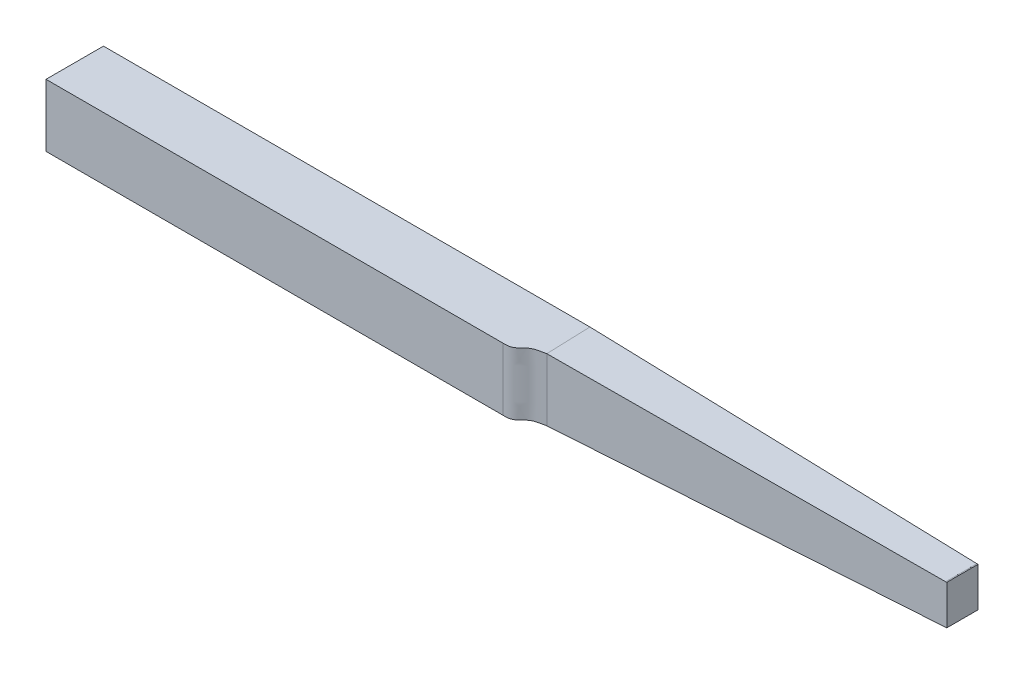
ISO-10303-21;
HEADER;
FILE_DESCRIPTION(('STEP AP214'),'2;1');
FILE_NAME('part.step','',(''),(''),'','','');
FILE_SCHEMA(('AUTOMOTIVE_DESIGN { 1 0 10303 214 1 1 1 1 }'));
ENDSEC;
DATA;
#1=APPLICATION_CONTEXT('core data for automotive mechanical design processes');
#2=APPLICATION_PROTOCOL_DEFINITION('international standard','automotive_design',2000,#1);
#3=PRODUCT_CONTEXT('',#1,'mechanical');
#4=PRODUCT('Part','Part','',(#3));
#5=PRODUCT_RELATED_PRODUCT_CATEGORY('part','',(#4));
#6=PRODUCT_DEFINITION_FORMATION('','',#4);
#7=PRODUCT_DEFINITION_CONTEXT('part definition',#1,'design');
#8=PRODUCT_DEFINITION('design','',#6,#7);
#9=PRODUCT_DEFINITION_SHAPE('','',#8);
#10=(LENGTH_UNIT() NAMED_UNIT(*) SI_UNIT(.MILLI.,.METRE.));
#11=(NAMED_UNIT(*) PLANE_ANGLE_UNIT() SI_UNIT($,.RADIAN.));
#12=(NAMED_UNIT(*) SI_UNIT($,.STERADIAN.) SOLID_ANGLE_UNIT());
#13=UNCERTAINTY_MEASURE_WITH_UNIT(LENGTH_MEASURE(1.E-05),#10,'distance_accuracy_value','');
#14=(GEOMETRIC_REPRESENTATION_CONTEXT(3) GLOBAL_UNCERTAINTY_ASSIGNED_CONTEXT((#13)) GLOBAL_UNIT_ASSIGNED_CONTEXT((#10,
#11,#12)) REPRESENTATION_CONTEXT('',''));
#15=CARTESIAN_POINT('',(0.,0.,0.));
#16=DIRECTION('',(0.,0.,1.));
#17=DIRECTION('',(1.,0.,0.));
#18=AXIS2_PLACEMENT_3D('',#15,#16,#17);
#19=CARTESIAN_POINT('',(0.,0.,0.));
#20=DIRECTION('',(0.,1.,0.));
#21=DIRECTION('',(0.,0.,1.));
#22=AXIS2_PLACEMENT_3D('',#19,#20,#21);
#23=PLANE('',#22);
#24=DIRECTION('',(-1.,0.,0.));
#25=VECTOR('',#24,1.);
#26=CARTESIAN_POINT('',(560.,0.,-36.8));
#27=LINE('',#26,#25);
#28=CARTESIAN_POINT('',(63.0124444444445,0.,-36.8));
#29=VERTEX_POINT('',#28);
#30=CARTESIAN_POINT('',(-560.,0.,-36.8));
#31=VERTEX_POINT('',#30);
#32=EDGE_CURVE('E84',#29,#31,#27,.T.);
#33=ORIENTED_EDGE('',*,*,#32,.F.);
#34=DIRECTION('',(0.0347265168990722,0.,0.999396852618647));
#35=VECTOR('',#34,1.);
#36=CARTESIAN_POINT('',(62.2218786480743,0.,-59.5517482094918));
#37=LINE('',#36,#35);
#38=CARTESIAN_POINT('',(65.,0.,20.4));
#39=VERTEX_POINT('',#38);
#40=EDGE_CURVE('E357',#29,#39,#37,.T.);
#41=ORIENTED_EDGE('',*,*,#40,.T.);
#42=CARTESIAN_POINT('',(65.,0.,20.4));
#43=CARTESIAN_POINT('',(56.7842442634511,0.,22.1075772442084));
#44=CARTESIAN_POINT('',(47.8187669649591,0.,23.3374381089836));
#45=CARTESIAN_POINT('',(39.8430139715066,0.,33.586115732493));
#46=CARTESIAN_POINT('',(32.9877524311891,0.,36.6310590317051));
#47=CARTESIAN_POINT('',(31.1757146223452,0.,36.8));
#48=CARTESIAN_POINT('',(25.,0.,36.8));
#49=B_SPLINE_CURVE_WITH_KNOTS('',3,(#42,#43,#44,#45,#46,#47,#48),.UNSPECIFIED.,.F.,.F.,(4,1,1,1,
4),(0.,0.422650190738557,0.727847648192994,0.789397597337319,1.),.UNSPECIFIED.);
#50=CARTESIAN_POINT('',(25.,0.,36.8));
#51=VERTEX_POINT('',#50);
#52=EDGE_CURVE('E145',#39,#51,#49,.T.);
#53=ORIENTED_EDGE('',*,*,#52,.T.);
#54=DIRECTION('',(1.,0.,0.));
#55=VECTOR('',#54,1.);
#56=CARTESIAN_POINT('',(560.,0.,36.8));
#57=LINE('',#56,#55);
#58=CARTESIAN_POINT('',(-560.,0.,36.8));
#59=VERTEX_POINT('',#58);
#60=EDGE_CURVE('E99',#59,#51,#57,.T.);
#61=ORIENTED_EDGE('',*,*,#60,.F.);
#62=DIRECTION('',(0.,0.,1.));
#63=VECTOR('',#62,1.);
#64=CARTESIAN_POINT('',(-560.,0.,36.8));
#65=LINE('',#64,#63);
#66=EDGE_CURVE('E104',#31,#59,#65,.T.);
#67=ORIENTED_EDGE('',*,*,#66,.F.);
#68=EDGE_LOOP('',(#33,#41,#53,#61,#67));
#69=FACE_BOUND('',#68,.T.);
#70=ADVANCED_FACE('F45',(#69),#23,.F.);
#71=CARTESIAN_POINT('',(560.,80.,36.8));
#72=DIRECTION('',(0.,0.,-1.));
#73=DIRECTION('',(-1.,0.,0.));
#74=AXIS2_PLACEMENT_3D('',#71,#72,#73);
#75=PLANE('',#74);
#76=ORIENTED_EDGE('',*,*,#60,.T.);
#77=DIRECTION('',(0.,1.,0.));
#78=VECTOR('',#77,1.);
#79=CARTESIAN_POINT('',(25.,0.,36.8));
#80=LINE('',#79,#78);
#81=CARTESIAN_POINT('',(25.,80.,36.8));
#82=VERTEX_POINT('',#81);
#83=EDGE_CURVE('E133',#51,#82,#80,.T.);
#84=ORIENTED_EDGE('',*,*,#83,.T.);
#85=DIRECTION('',(1.,0.,0.));
#86=VECTOR('',#85,1.);
#87=CARTESIAN_POINT('',(560.,80.,36.8));
#88=LINE('',#87,#86);
#89=CARTESIAN_POINT('',(-560.,80.,36.8));
#90=VERTEX_POINT('',#89);
#91=EDGE_CURVE('E130',#90,#82,#88,.T.);
#92=ORIENTED_EDGE('',*,*,#91,.F.);
#93=DIRECTION('',(0.,-1.,0.));
#94=VECTOR('',#93,1.);
#95=CARTESIAN_POINT('',(-560.,80.,36.8));
#96=LINE('',#95,#94);
#97=EDGE_CURVE('E54',#90,#59,#96,.T.);
#98=ORIENTED_EDGE('',*,*,#97,.T.);
#99=EDGE_LOOP('',(#76,#84,#92,#98));
#100=FACE_BOUND('',#99,.T.);
#101=ADVANCED_FACE('F127',(#100),#75,.F.);
#102=CARTESIAN_POINT('',(-560.,80.,36.8));
#103=DIRECTION('',(1.,0.,0.));
#104=DIRECTION('',(0.,0.,-1.));
#105=AXIS2_PLACEMENT_3D('',#102,#103,#104);
#106=PLANE('',#105);
#107=ORIENTED_EDGE('',*,*,#66,.T.);
#108=ORIENTED_EDGE('',*,*,#97,.F.);
#109=DIRECTION('',(0.,0.,1.));
#110=VECTOR('',#109,1.);
#111=CARTESIAN_POINT('',(-560.,80.,36.8));
#112=LINE('',#111,#110);
#113=CARTESIAN_POINT('',(-560.,80.,-36.8));
#114=VERTEX_POINT('',#113);
#115=EDGE_CURVE('E98',#114,#90,#112,.T.);
#116=ORIENTED_EDGE('',*,*,#115,.F.);
#117=DIRECTION('',(0.,-1.,0.));
#118=VECTOR('',#117,1.);
#119=CARTESIAN_POINT('',(-560.,80.,-36.8));
#120=LINE('',#119,#118);
#121=EDGE_CURVE('E88',#114,#31,#120,.T.);
#122=ORIENTED_EDGE('',*,*,#121,.T.);
#123=EDGE_LOOP('',(#107,#108,#116,#122));
#124=FACE_BOUND('',#123,.T.);
#125=ADVANCED_FACE('F47',(#124),#106,.F.);
#126=CARTESIAN_POINT('',(560.,80.,36.8));
#127=DIRECTION('',(-1.,0.,0.));
#128=DIRECTION('',(0.,0.,1.));
#129=AXIS2_PLACEMENT_3D('',#126,#127,#128);
#130=PLANE('',#129);
#131=DIRECTION('',(0.,-1.,0.));
#132=VECTOR('',#131,1.);
#133=CARTESIAN_POINT('',(560.,80.,-36.8));
#134=LINE('',#133,#132);
#135=CARTESIAN_POINT('',(560.,65.25,-36.8));
#136=VERTEX_POINT('',#135);
#137=CARTESIAN_POINT('',(560.,14.75,-36.8));
#138=VERTEX_POINT('',#137);
#139=EDGE_CURVE('E106',#136,#138,#134,.T.);
#140=ORIENTED_EDGE('',*,*,#139,.F.);
#141=DIRECTION('',(0.,0.,-1.));
#142=VECTOR('',#141,1.);
#143=CARTESIAN_POINT('',(560.,65.25,43.2));
#144=LINE('',#143,#142);
#145=CARTESIAN_POINT('',(560.,65.2500000000057,3.20000001103306));
#146=VERTEX_POINT('',#145);
#147=EDGE_CURVE('E316',#146,#136,#144,.T.);
#148=ORIENTED_EDGE('',*,*,#147,.F.);
#149=DIRECTION('',(0.,-1.,0.));
#150=VECTOR('',#149,1.);
#151=CARTESIAN_POINT('',(560.,1586.57882822116,3.2));
#152=LINE('',#151,#150);
#153=CARTESIAN_POINT('',(560.,14.75,3.20000000002681));
#154=VERTEX_POINT('',#153);
#155=EDGE_CURVE('E118',#146,#154,#152,.T.);
#156=ORIENTED_EDGE('',*,*,#155,.T.);
#157=DIRECTION('',(0.,0.,-1.));
#158=VECTOR('',#157,1.);
#159=CARTESIAN_POINT('',(560.,14.75,43.2));
#160=LINE('',#159,#158);
#161=EDGE_CURVE('E338',#154,#138,#160,.T.);
#162=ORIENTED_EDGE('',*,*,#161,.T.);
#163=EDGE_LOOP('',(#140,#148,#156,#162));
#164=FACE_BOUND('',#163,.T.);
#165=ADVANCED_FACE('F182',(#164),#130,.F.);
#166=CARTESIAN_POINT('',(560.,80.,-36.8));
#167=DIRECTION('',(0.,0.,1.));
#168=DIRECTION('',(1.,0.,0.));
#169=AXIS2_PLACEMENT_3D('',#166,#167,#168);
#170=PLANE('',#169);
#171=DIRECTION('',(0.999557404333975,-0.0297488729387744,0.));
#172=VECTOR('',#171,1.);
#173=CARTESIAN_POINT('',(559.560168279036,65.2217240547224,-36.8));
#174=LINE('',#173,#172);
#175=CARTESIAN_POINT('',(63.0124444444445,80.,-36.8));
#176=VERTEX_POINT('',#175);
#177=CARTESIAN_POINT('',(558.610101010101,65.25,-36.8));
#178=VERTEX_POINT('',#177);
#179=EDGE_CURVE('E330',#176,#178,#174,.T.);
#180=ORIENTED_EDGE('',*,*,#179,.T.);
#181=DIRECTION('',(-1.,0.,0.));
#182=VECTOR('',#181,1.);
#183=CARTESIAN_POINT('',(558.610101010101,65.25,-36.8));
#184=LINE('',#183,#182);
#185=EDGE_CURVE('E314',#136,#178,#184,.T.);
#186=ORIENTED_EDGE('',*,*,#185,.F.);
#187=ORIENTED_EDGE('',*,*,#139,.T.);
#188=DIRECTION('',(1.,0.,0.));
#189=VECTOR('',#188,1.);
#190=CARTESIAN_POINT('',(558.610101010101,14.75,-36.8));
#191=LINE('',#190,#189);
#192=CARTESIAN_POINT('',(558.610101010101,14.75,-36.8));
#193=VERTEX_POINT('',#192);
#194=EDGE_CURVE('E333',#193,#138,#191,.T.);
#195=ORIENTED_EDGE('',*,*,#194,.F.);
#196=DIRECTION('',(-0.999557404333975,-0.0297488729387745,0.));
#197=VECTOR('',#196,1.);
#198=CARTESIAN_POINT('',(561.93902477636,14.8490755805679,-36.8));
#199=LINE('',#198,#197);
#200=EDGE_CURVE('E93',#193,#29,#199,.T.);
#201=ORIENTED_EDGE('',*,*,#200,.T.);
#202=ORIENTED_EDGE('',*,*,#32,.T.);
#203=ORIENTED_EDGE('',*,*,#121,.F.);
#204=DIRECTION('',(-1.,0.,0.));
#205=VECTOR('',#204,1.);
#206=CARTESIAN_POINT('',(560.,80.,-36.8));
#207=LINE('',#206,#205);
#208=EDGE_CURVE('E70',#176,#114,#207,.T.);
#209=ORIENTED_EDGE('',*,*,#208,.F.);
#210=EDGE_LOOP('',(#180,#186,#187,#195,#201,#202,#203,#209));
#211=FACE_BOUND('',#210,.T.);
#212=ADVANCED_FACE('F87',(#211),#170,.F.);
#213=CARTESIAN_POINT('',(0.,80.,0.));
#214=DIRECTION('',(0.,1.,0.));
#215=DIRECTION('',(0.,0.,1.));
#216=AXIS2_PLACEMENT_3D('',#213,#214,#215);
#217=PLANE('',#216);
#218=DIRECTION('',(0.0347265168990722,0.,0.999396852618647));
#219=VECTOR('',#218,1.);
#220=CARTESIAN_POINT('',(62.2218786480743,80.,-59.5517482094918));
#221=LINE('',#220,#219);
#222=CARTESIAN_POINT('',(65.,80.,20.4));
#223=VERTEX_POINT('',#222);
#224=EDGE_CURVE('E326',#176,#223,#221,.T.);
#225=ORIENTED_EDGE('',*,*,#224,.F.);
#226=ORIENTED_EDGE('',*,*,#208,.T.);
#227=ORIENTED_EDGE('',*,*,#115,.T.);
#228=ORIENTED_EDGE('',*,*,#91,.T.);
#229=CARTESIAN_POINT('',(65.,80.,20.4));
#230=CARTESIAN_POINT('',(56.7842442634511,80.,22.1075772442084));
#231=CARTESIAN_POINT('',(47.8187669649591,80.,23.3374381089836));
#232=CARTESIAN_POINT('',(39.8430139715066,80.,33.586115732493));
#233=CARTESIAN_POINT('',(32.9877524311891,80.,36.6310590317051));
#234=CARTESIAN_POINT('',(31.1757146223452,80.,36.8));
#235=CARTESIAN_POINT('',(25.,80.,36.8));
#236=B_SPLINE_CURVE_WITH_KNOTS('',3,(#229,#230,#231,#232,#233,#234,#235),.UNSPECIFIED.,.F.,.F.,
(4,1,1,1,4),(0.,0.422650190738557,0.727847648192994,0.789397597337319,1.),.UNSPECIFIED.);
#237=EDGE_CURVE('E146',#223,#82,#236,.T.);
#238=ORIENTED_EDGE('',*,*,#237,.F.);
#239=EDGE_LOOP('',(#225,#226,#227,#228,#238));
#240=FACE_BOUND('',#239,.T.);
#241=ADVANCED_FACE('F136',(#240),#217,.T.);
#242=CARTESIAN_POINT('',(560.,1586.57882822116,3.2));
#243=DIRECTION('',(0.0347265168990722,0.,0.999396852618648));
#244=DIRECTION('',(0.999396852618648,0.,-0.0347265168990722));
#245=AXIS2_PLACEMENT_3D('',#242,#243,#244);
#246=PLANE('',#245);
#247=DIRECTION('',(0.,-1.,0.));
#248=VECTOR('',#247,1.);
#249=CARTESIAN_POINT('',(558.610101010112,1586.57882822116,3.24829548005267));
#250=LINE('',#249,#248);
#251=CARTESIAN_POINT('',(558.610101010101,65.2914161820223,3.24829548005307));
#252=VERTEX_POINT('',#251);
#253=CARTESIAN_POINT('',(558.610101010101,65.25,3.24829548005307));
#254=VERTEX_POINT('',#253);
#255=EDGE_CURVE('E295',#252,#254,#250,.T.);
#256=ORIENTED_EDGE('',*,*,#255,.F.);
#257=DIRECTION('',(0.998953990196033,-0.0297668108189726,-0.0347111285482258));
#258=VECTOR('',#257,1.);
#259=CARTESIAN_POINT('',(65.,80.,20.4));
#260=LINE('',#259,#258);
#261=EDGE_CURVE('E306',#223,#252,#260,.T.);
#262=ORIENTED_EDGE('',*,*,#261,.F.);
#263=DIRECTION('',(0.,-1.,0.));
#264=VECTOR('',#263,1.);
#265=CARTESIAN_POINT('',(65.,1586.57882822116,20.4));
#266=LINE('',#265,#264);
#267=EDGE_CURVE('E112',#223,#39,#266,.T.);
#268=ORIENTED_EDGE('',*,*,#267,.T.);
#269=DIRECTION('',(-0.998953990196033,-0.0297668108189727,0.0347111285482258));
#270=VECTOR('',#269,1.);
#271=CARTESIAN_POINT('',(65.,0.,20.4));
#272=LINE('',#271,#270);
#273=CARTESIAN_POINT('',(558.610101010101,14.7085838179778,3.24829548005307));
#274=VERTEX_POINT('',#273);
#275=EDGE_CURVE('E354',#274,#39,#272,.T.);
#276=ORIENTED_EDGE('',*,*,#275,.F.);
#277=DIRECTION('',(0.,-1.,0.));
#278=VECTOR('',#277,1.);
#279=CARTESIAN_POINT('',(558.610101010101,1586.57882822116,3.24829548005306));
#280=LINE('',#279,#278);
#281=CARTESIAN_POINT('',(558.610101010101,14.75,3.24829548005307));
#282=VERTEX_POINT('',#281);
#283=EDGE_CURVE('E61',#282,#274,#280,.T.);
#284=ORIENTED_EDGE('',*,*,#283,.F.);
#285=DIRECTION('',(-0.999396852618648,0.,0.0347265168990722));
#286=VECTOR('',#285,1.);
#287=CARTESIAN_POINT('',(560.,14.75,3.2));
#288=LINE('',#287,#286);
#289=EDGE_CURVE('E342',#154,#282,#288,.T.);
#290=ORIENTED_EDGE('',*,*,#289,.F.);
#291=ORIENTED_EDGE('',*,*,#155,.F.);
#292=DIRECTION('',(0.999396852618648,0.,-0.0347265168990722));
#293=VECTOR('',#292,1.);
#294=CARTESIAN_POINT('',(560.,65.25,3.2));
#295=LINE('',#294,#293);
#296=EDGE_CURVE('E307',#254,#146,#295,.T.);
#297=ORIENTED_EDGE('',*,*,#296,.F.);
#298=EDGE_LOOP('',(#256,#262,#268,#276,#284,#290,#291,#297));
#299=FACE_BOUND('',#298,.T.);
#300=ADVANCED_FACE('F170',(#299),#246,.T.);
#301=DIRECTION('',(0.,1.,0.));
#302=VECTOR('',#301,1.);
#303=SURFACE_OF_LINEAR_EXTRUSION('',#49,#302);
#304=ORIENTED_EDGE('',*,*,#237,.T.);
#305=ORIENTED_EDGE('',*,*,#83,.F.);
#306=ORIENTED_EDGE('',*,*,#52,.F.);
#307=ORIENTED_EDGE('',*,*,#267,.F.);
#308=EDGE_LOOP('',(#304,#305,#306,#307));
#309=FACE_BOUND('',#308,.T.);
#310=ADVANCED_FACE('F165',(#309),#303,.F.);
#311=CARTESIAN_POINT('',(62.2218786480743,0.,-59.5517482094918));
#312=DIRECTION('',(-0.029748857044976,0.99955687030487,0.00103369765893654));
#313=DIRECTION('',(-0.999557404333975,-0.0297488729387745,0.));
#314=AXIS2_PLACEMENT_3D('',#311,#312,#313);
#315=PLANE('',#314);
#316=ORIENTED_EDGE('',*,*,#200,.F.);
#317=DIRECTION('',(0.,-0.00103415537113261,0.999999465261191));
#318=VECTOR('',#317,1.);
#319=CARTESIAN_POINT('',(558.610101010101,14.7735130552411,-59.5364700934454));
#320=LINE('',#319,#318);
#321=EDGE_CURVE('E349',#193,#274,#320,.T.);
#322=ORIENTED_EDGE('',*,*,#321,.T.);
#323=ORIENTED_EDGE('',*,*,#275,.T.);
#324=ORIENTED_EDGE('',*,*,#40,.F.);
#325=EDGE_LOOP('',(#316,#322,#323,#324));
#326=FACE_BOUND('',#325,.T.);
#327=ADVANCED_FACE('F169',(#326),#315,.F.);
#328=CARTESIAN_POINT('',(558.610101010101,14.75,43.2));
#329=DIRECTION('',(0.,1.,0.));
#330=DIRECTION('',(0.,0.,1.));
#331=AXIS2_PLACEMENT_3D('',#328,#329,#330);
#332=PLANE('',#331);
#333=ORIENTED_EDGE('',*,*,#194,.T.);
#334=ORIENTED_EDGE('',*,*,#161,.F.);
#335=ORIENTED_EDGE('',*,*,#289,.T.);
#336=DIRECTION('',(0.,0.,-1.));
#337=VECTOR('',#336,1.);
#338=CARTESIAN_POINT('',(558.610101010101,14.75,43.2));
#339=LINE('',#338,#337);
#340=EDGE_CURVE('E337',#282,#193,#339,.T.);
#341=ORIENTED_EDGE('',*,*,#340,.T.);
#342=EDGE_LOOP('',(#333,#334,#335,#341));
#343=FACE_BOUND('',#342,.T.);
#344=ADVANCED_FACE('F242',(#343),#332,.F.);
#345=CARTESIAN_POINT('',(558.610101010101,0.,43.2));
#346=DIRECTION('',(-1.,0.,0.));
#347=DIRECTION('',(0.,0.,1.));
#348=AXIS2_PLACEMENT_3D('',#345,#346,#347);
#349=PLANE('',#348);
#350=ORIENTED_EDGE('',*,*,#283,.T.);
#351=ORIENTED_EDGE('',*,*,#321,.F.);
#352=ORIENTED_EDGE('',*,*,#340,.F.);
#353=EDGE_LOOP('',(#350,#351,#352));
#354=FACE_BOUND('',#353,.T.);
#355=ADVANCED_FACE('F251',(#354),#349,.F.);
#356=CARTESIAN_POINT('',(62.2218786480743,80.,-59.5517482094918));
#357=DIRECTION('',(-0.0297488570449759,-0.99955687030487,0.00103369765893654));
#358=DIRECTION('',(0.999557404333975,-0.0297488729387744,0.));
#359=AXIS2_PLACEMENT_3D('',#356,#357,#358);
#360=PLANE('',#359);
#361=ORIENTED_EDGE('',*,*,#261,.T.);
#362=DIRECTION('',(0.,-0.00103415537113261,-0.999999465261191));
#363=VECTOR('',#362,1.);
#364=CARTESIAN_POINT('',(558.610101010101,65.226486944759,-59.5364700934454));
#365=LINE('',#364,#363);
#366=EDGE_CURVE('E11',#252,#178,#365,.T.);
#367=ORIENTED_EDGE('',*,*,#366,.T.);
#368=ORIENTED_EDGE('',*,*,#179,.F.);
#369=ORIENTED_EDGE('',*,*,#224,.T.);
#370=EDGE_LOOP('',(#361,#367,#368,#369));
#371=FACE_BOUND('',#370,.T.);
#372=ADVANCED_FACE('F260',(#371),#360,.F.);
#373=CARTESIAN_POINT('',(558.610101010101,65.25,43.2));
#374=DIRECTION('',(0.,-1.,0.));
#375=DIRECTION('',(0.,0.,-1.));
#376=AXIS2_PLACEMENT_3D('',#373,#374,#375);
#377=PLANE('',#376);
#378=ORIENTED_EDGE('',*,*,#296,.T.);
#379=ORIENTED_EDGE('',*,*,#147,.T.);
#380=ORIENTED_EDGE('',*,*,#185,.T.);
#381=DIRECTION('',(0.,0.,-1.));
#382=VECTOR('',#381,1.);
#383=CARTESIAN_POINT('',(558.610101010101,65.25,43.2));
#384=LINE('',#383,#382);
#385=EDGE_CURVE('E298',#254,#178,#384,.T.);
#386=ORIENTED_EDGE('',*,*,#385,.F.);
#387=EDGE_LOOP('',(#378,#379,#380,#386));
#388=FACE_BOUND('',#387,.T.);
#389=ADVANCED_FACE('F267',(#388),#377,.F.);
#390=CARTESIAN_POINT('',(558.610101010101,80.,43.2));
#391=DIRECTION('',(-1.,0.,0.));
#392=DIRECTION('',(0.,-1.,0.));
#393=AXIS2_PLACEMENT_3D('',#390,#391,#392);
#394=PLANE('',#393);
#395=ORIENTED_EDGE('',*,*,#255,.T.);
#396=ORIENTED_EDGE('',*,*,#385,.T.);
#397=ORIENTED_EDGE('',*,*,#366,.F.);
#398=EDGE_LOOP('',(#395,#396,#397));
#399=FACE_BOUND('',#398,.T.);
#400=ADVANCED_FACE('F277',(#399),#394,.F.);
#401=CLOSED_SHELL('',(#70,#101,#125,#165,#212,#241,#300,#310,#327,#344,#355,#372,#389,#400));
#402=MANIFOLD_SOLID_BREP('B2',#401);
#403=ADVANCED_BREP_SHAPE_REPRESENTATION('',(#18,#402),#14);
#404=SHAPE_DEFINITION_REPRESENTATION(#9,#403);
ENDSEC;
END-ISO-10303-21;
